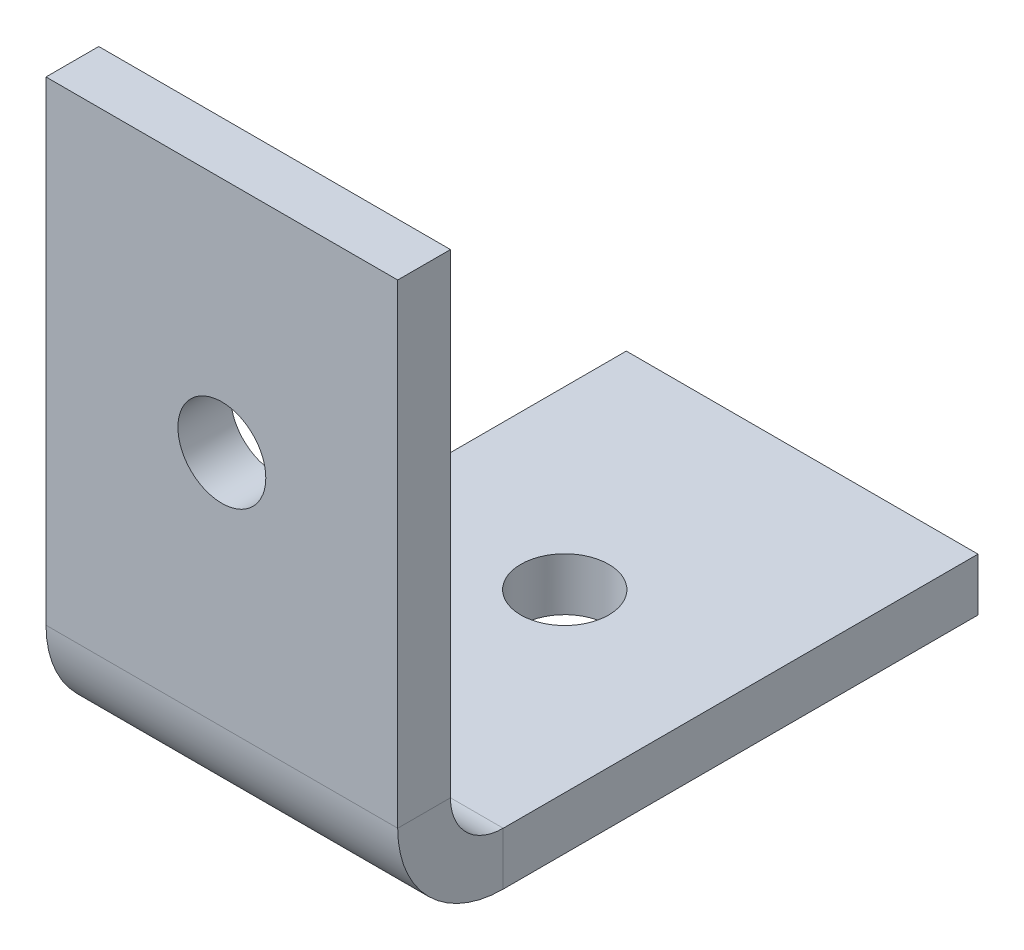
ISO-10303-21;
HEADER;
FILE_DESCRIPTION(('STEP AP214'),'2;1');
FILE_NAME('part.step','',(''),(''),'','','');
FILE_SCHEMA(('AUTOMOTIVE_DESIGN { 1 0 10303 214 1 1 1 1 }'));
ENDSEC;
DATA;
#1=APPLICATION_CONTEXT('core data for automotive mechanical design processes');
#2=APPLICATION_PROTOCOL_DEFINITION('international standard','automotive_design',2000,#1);
#3=PRODUCT_CONTEXT('',#1,'mechanical');
#4=PRODUCT('Part','Part','',(#3));
#5=PRODUCT_RELATED_PRODUCT_CATEGORY('part','',(#4));
#6=PRODUCT_DEFINITION_FORMATION('','',#4);
#7=PRODUCT_DEFINITION_CONTEXT('part definition',#1,'design');
#8=PRODUCT_DEFINITION('design','',#6,#7);
#9=PRODUCT_DEFINITION_SHAPE('','',#8);
#10=(LENGTH_UNIT() NAMED_UNIT(*) SI_UNIT(.MILLI.,.METRE.));
#11=(NAMED_UNIT(*) PLANE_ANGLE_UNIT() SI_UNIT($,.RADIAN.));
#12=(NAMED_UNIT(*) SI_UNIT($,.STERADIAN.) SOLID_ANGLE_UNIT());
#13=UNCERTAINTY_MEASURE_WITH_UNIT(LENGTH_MEASURE(1.E-05),#10,'distance_accuracy_value','');
#14=(GEOMETRIC_REPRESENTATION_CONTEXT(3) GLOBAL_UNCERTAINTY_ASSIGNED_CONTEXT((#13)) GLOBAL_UNIT_ASSIGNED_CONTEXT((#10,
#11,#12)) REPRESENTATION_CONTEXT('',''));
#15=CARTESIAN_POINT('',(0.,0.,0.));
#16=DIRECTION('',(0.,0.,1.));
#17=DIRECTION('',(1.,0.,0.));
#18=AXIS2_PLACEMENT_3D('',#15,#16,#17);
#19=CARTESIAN_POINT('',(20.,0.,-3.));
#20=DIRECTION('',(1.,0.,0.));
#21=DIRECTION('',(0.,0.,-1.));
#22=AXIS2_PLACEMENT_3D('',#19,#20,#21);
#23=PLANE('',#22);
#24=DIRECTION('',(0.,-1.,0.));
#25=VECTOR('',#24,1.);
#26=CARTESIAN_POINT('',(20.,0.,-3.));
#27=LINE('',#26,#25);
#28=CARTESIAN_POINT('',(20.,0.,-3.));
#29=VERTEX_POINT('',#28);
#30=CARTESIAN_POINT('',(20.,-3.,-3.));
#31=VERTEX_POINT('',#30);
#32=EDGE_CURVE('E11',#29,#31,#27,.T.);
#33=ORIENTED_EDGE('',*,*,#32,.F.);
#34=CARTESIAN_POINT('',(20.,3.,-3.));
#35=DIRECTION('',(-1.,0.,0.));
#36=DIRECTION('',(0.,0.,1.));
#37=AXIS2_PLACEMENT_3D('',#34,#35,#36);
#38=CIRCLE('',#37,3.);
#39=CARTESIAN_POINT('',(20.,3.,0.));
#40=VERTEX_POINT('',#39);
#41=EDGE_CURVE('E134',#40,#29,#38,.F.);
#42=ORIENTED_EDGE('',*,*,#41,.F.);
#43=DIRECTION('',(0.,0.,-1.));
#44=VECTOR('',#43,1.);
#45=CARTESIAN_POINT('',(20.,3.,3.));
#46=LINE('',#45,#44);
#47=CARTESIAN_POINT('',(20.,3.,3.));
#48=VERTEX_POINT('',#47);
#49=EDGE_CURVE('E45',#48,#40,#46,.T.);
#50=ORIENTED_EDGE('',*,*,#49,.F.);
#51=CARTESIAN_POINT('',(20.,3.,-3.));
#52=DIRECTION('',(1.,0.,0.));
#53=DIRECTION('',(0.,0.,-1.));
#54=AXIS2_PLACEMENT_3D('',#51,#52,#53);
#55=CIRCLE('',#54,6.);
#56=EDGE_CURVE('E127',#48,#31,#55,.T.);
#57=ORIENTED_EDGE('',*,*,#56,.T.);
#58=EDGE_LOOP('',(#33,#42,#50,#57));
#59=FACE_BOUND('',#58,.T.);
#60=ADVANCED_FACE('F37',(#59),#23,.T.);
#61=CARTESIAN_POINT('',(20.,3.,3.));
#62=DIRECTION('',(1.,0.,0.));
#63=DIRECTION('',(0.,0.,-1.));
#64=AXIS2_PLACEMENT_3D('',#61,#62,#63);
#65=PLANE('',#64);
#66=DIRECTION('',(0.,0.,-1.));
#67=VECTOR('',#66,1.);
#68=CARTESIAN_POINT('',(20.,0.,0.));
#69=LINE('',#68,#67);
#70=CARTESIAN_POINT('',(20.,0.,-30.));
#71=VERTEX_POINT('',#70);
#72=EDGE_CURVE('E184',#29,#71,#69,.T.);
#73=ORIENTED_EDGE('',*,*,#72,.F.);
#74=ORIENTED_EDGE('',*,*,#32,.T.);
#75=DIRECTION('',(0.,0.,-1.));
#76=VECTOR('',#75,1.);
#77=CARTESIAN_POINT('',(20.,-3.,0.));
#78=LINE('',#77,#76);
#79=CARTESIAN_POINT('',(20.,-3.,-30.));
#80=VERTEX_POINT('',#79);
#81=EDGE_CURVE('E93',#31,#80,#78,.T.);
#82=ORIENTED_EDGE('',*,*,#81,.T.);
#83=DIRECTION('',(0.,-1.,0.));
#84=VECTOR('',#83,1.);
#85=CARTESIAN_POINT('',(20.,0.,-30.));
#86=LINE('',#85,#84);
#87=EDGE_CURVE('E380',#71,#80,#86,.T.);
#88=ORIENTED_EDGE('',*,*,#87,.F.);
#89=EDGE_LOOP('',(#73,#74,#82,#88));
#90=FACE_BOUND('',#89,.T.);
#91=ADVANCED_FACE('F192',(#90),#65,.T.);
#92=CARTESIAN_POINT('',(0.,3.,0.));
#93=DIRECTION('',(-1.,0.,0.));
#94=DIRECTION('',(0.,0.,1.));
#95=AXIS2_PLACEMENT_3D('',#92,#93,#94);
#96=PLANE('',#95);
#97=DIRECTION('',(0.,0.,1.));
#98=VECTOR('',#97,1.);
#99=CARTESIAN_POINT('',(0.,3.,0.));
#100=LINE('',#99,#98);
#101=CARTESIAN_POINT('',(0.,3.,0.));
#102=VERTEX_POINT('',#101);
#103=CARTESIAN_POINT('',(0.,3.,3.));
#104=VERTEX_POINT('',#103);
#105=EDGE_CURVE('E80',#102,#104,#100,.T.);
#106=ORIENTED_EDGE('',*,*,#105,.F.);
#107=CARTESIAN_POINT('',(0.,3.,-3.));
#108=DIRECTION('',(-1.,0.,0.));
#109=DIRECTION('',(0.,0.,1.));
#110=AXIS2_PLACEMENT_3D('',#107,#108,#109);
#111=CIRCLE('',#110,3.);
#112=CARTESIAN_POINT('',(0.,0.,-3.));
#113=VERTEX_POINT('',#112);
#114=EDGE_CURVE('E150',#102,#113,#111,.F.);
#115=ORIENTED_EDGE('',*,*,#114,.T.);
#116=DIRECTION('',(0.,1.,0.));
#117=VECTOR('',#116,1.);
#118=CARTESIAN_POINT('',(0.,-3.,-3.));
#119=LINE('',#118,#117);
#120=CARTESIAN_POINT('',(0.,-3.,-3.));
#121=VERTEX_POINT('',#120);
#122=EDGE_CURVE('E87',#121,#113,#119,.T.);
#123=ORIENTED_EDGE('',*,*,#122,.F.);
#124=CARTESIAN_POINT('',(0.,3.,-3.));
#125=DIRECTION('',(1.,0.,0.));
#126=DIRECTION('',(0.,0.,-1.));
#127=AXIS2_PLACEMENT_3D('',#124,#125,#126);
#128=CIRCLE('',#127,6.);
#129=EDGE_CURVE('E157',#104,#121,#128,.T.);
#130=ORIENTED_EDGE('',*,*,#129,.F.);
#131=EDGE_LOOP('',(#106,#115,#123,#130));
#132=FACE_BOUND('',#131,.T.);
#133=ADVANCED_FACE('F190',(#132),#96,.T.);
#134=CARTESIAN_POINT('',(0.,-3.,-3.));
#135=DIRECTION('',(-1.,0.,0.));
#136=DIRECTION('',(0.,0.,1.));
#137=AXIS2_PLACEMENT_3D('',#134,#135,#136);
#138=PLANE('',#137);
#139=DIRECTION('',(0.,-1.,0.));
#140=VECTOR('',#139,1.);
#141=CARTESIAN_POINT('',(0.,0.,0.));
#142=LINE('',#141,#140);
#143=CARTESIAN_POINT('',(0.,30.,0.));
#144=VERTEX_POINT('',#143);
#145=EDGE_CURVE('E152',#144,#102,#142,.T.);
#146=ORIENTED_EDGE('',*,*,#145,.T.);
#147=ORIENTED_EDGE('',*,*,#105,.T.);
#148=DIRECTION('',(0.,1.,0.));
#149=VECTOR('',#148,1.);
#150=CARTESIAN_POINT('',(0.,0.,3.));
#151=LINE('',#150,#149);
#152=CARTESIAN_POINT('',(0.,30.,3.));
#153=VERTEX_POINT('',#152);
#154=EDGE_CURVE('E155',#153,#104,#151,.F.);
#155=ORIENTED_EDGE('',*,*,#154,.F.);
#156=DIRECTION('',(0.,0.,-1.));
#157=VECTOR('',#156,1.);
#158=CARTESIAN_POINT('',(0.,30.,3.));
#159=LINE('',#158,#157);
#160=EDGE_CURVE('E115',#153,#144,#159,.T.);
#161=ORIENTED_EDGE('',*,*,#160,.T.);
#162=EDGE_LOOP('',(#146,#147,#155,#161));
#163=FACE_BOUND('',#162,.T.);
#164=ADVANCED_FACE('F186',(#163),#138,.T.);
#165=CARTESIAN_POINT('',(20.,-3.,0.));
#166=DIRECTION('',(0.,1.,0.));
#167=DIRECTION('',(0.,0.,1.));
#168=AXIS2_PLACEMENT_3D('',#165,#166,#167);
#169=PLANE('',#168);
#170=CARTESIAN_POINT('',(10.,-3.,-16.5));
#171=DIRECTION('',(0.,-1.,0.));
#172=DIRECTION('',(0.,0.,-1.));
#173=AXIS2_PLACEMENT_3D('',#170,#171,#172);
#174=CIRCLE('',#173,2.5);
#175=CARTESIAN_POINT('',(10.,-3.,-19.));
#176=VERTEX_POINT('',#175);
#177=EDGE_CURVE('E144',#176,#176,#174,.T.);
#178=ORIENTED_EDGE('',*,*,#177,.F.);
#179=EDGE_LOOP('',(#178));
#180=FACE_BOUND('',#179,.T.);
#181=DIRECTION('',(0.,0.,-1.));
#182=VECTOR('',#181,1.);
#183=CARTESIAN_POINT('',(0.,-3.,0.));
#184=LINE('',#183,#182);
#185=CARTESIAN_POINT('',(0.,-3.,-30.));
#186=VERTEX_POINT('',#185);
#187=EDGE_CURVE('E140',#121,#186,#184,.T.);
#188=ORIENTED_EDGE('',*,*,#187,.T.);
#189=DIRECTION('',(-1.,0.,0.));
#190=VECTOR('',#189,1.);
#191=CARTESIAN_POINT('',(20.,-3.,-30.));
#192=LINE('',#191,#190);
#193=EDGE_CURVE('E171',#80,#186,#192,.T.);
#194=ORIENTED_EDGE('',*,*,#193,.F.);
#195=ORIENTED_EDGE('',*,*,#81,.F.);
#196=DIRECTION('',(-1.,0.,0.));
#197=VECTOR('',#196,1.);
#198=CARTESIAN_POINT('',(20.,-3.,-3.));
#199=LINE('',#198,#197);
#200=EDGE_CURVE('E139',#31,#121,#199,.T.);
#201=ORIENTED_EDGE('',*,*,#200,.T.);
#202=EDGE_LOOP('',(#188,#194,#195,#201));
#203=FACE_BOUND('',#202,.T.);
#204=ADVANCED_FACE('F198',(#180,#203),#169,.F.);
#205=CARTESIAN_POINT('',(20.,0.,-30.));
#206=DIRECTION('',(0.,0.,-1.));
#207=DIRECTION('',(-1.,0.,0.));
#208=AXIS2_PLACEMENT_3D('',#205,#206,#207);
#209=PLANE('',#208);
#210=DIRECTION('',(0.,-1.,0.));
#211=VECTOR('',#210,1.);
#212=CARTESIAN_POINT('',(0.,0.,-30.));
#213=LINE('',#212,#211);
#214=CARTESIAN_POINT('',(0.,0.,-30.));
#215=VERTEX_POINT('',#214);
#216=EDGE_CURVE('E143',#215,#186,#213,.T.);
#217=ORIENTED_EDGE('',*,*,#216,.F.);
#218=DIRECTION('',(-1.,0.,0.));
#219=VECTOR('',#218,1.);
#220=CARTESIAN_POINT('',(20.,0.,-30.));
#221=LINE('',#220,#219);
#222=EDGE_CURVE('E169',#71,#215,#221,.T.);
#223=ORIENTED_EDGE('',*,*,#222,.F.);
#224=ORIENTED_EDGE('',*,*,#87,.T.);
#225=ORIENTED_EDGE('',*,*,#193,.T.);
#226=EDGE_LOOP('',(#217,#223,#224,#225));
#227=FACE_BOUND('',#226,.T.);
#228=ADVANCED_FACE('F227',(#227),#209,.T.);
#229=CARTESIAN_POINT('',(20.,0.,0.));
#230=DIRECTION('',(0.,1.,0.));
#231=DIRECTION('',(0.,0.,1.));
#232=AXIS2_PLACEMENT_3D('',#229,#230,#231);
#233=PLANE('',#232);
#234=CARTESIAN_POINT('',(10.,0.,-16.5));
#235=DIRECTION('',(0.,1.,0.));
#236=DIRECTION('',(0.,0.,1.));
#237=AXIS2_PLACEMENT_3D('',#234,#235,#236);
#238=CIRCLE('',#237,2.5);
#239=CARTESIAN_POINT('',(10.,0.,-14.));
#240=VERTEX_POINT('',#239);
#241=EDGE_CURVE('E371',#240,#240,#238,.F.);
#242=ORIENTED_EDGE('',*,*,#241,.T.);
#243=EDGE_LOOP('',(#242));
#244=FACE_BOUND('',#243,.T.);
#245=DIRECTION('',(0.,0.,-1.));
#246=VECTOR('',#245,1.);
#247=CARTESIAN_POINT('',(0.,0.,0.));
#248=LINE('',#247,#246);
#249=EDGE_CURVE('E147',#113,#215,#248,.T.);
#250=ORIENTED_EDGE('',*,*,#249,.F.);
#251=DIRECTION('',(-1.,0.,0.));
#252=VECTOR('',#251,1.);
#253=CARTESIAN_POINT('',(20.,0.,-3.));
#254=LINE('',#253,#252);
#255=EDGE_CURVE('E166',#29,#113,#254,.T.);
#256=ORIENTED_EDGE('',*,*,#255,.F.);
#257=ORIENTED_EDGE('',*,*,#72,.T.);
#258=ORIENTED_EDGE('',*,*,#222,.T.);
#259=EDGE_LOOP('',(#250,#256,#257,#258));
#260=FACE_BOUND('',#259,.T.);
#261=ADVANCED_FACE('F232',(#244,#260),#233,.T.);
#262=CARTESIAN_POINT('',(20.,3.,-3.));
#263=DIRECTION('',(-1.,0.,0.));
#264=DIRECTION('',(0.,0.,1.));
#265=AXIS2_PLACEMENT_3D('',#262,#263,#264);
#266=CYLINDRICAL_SURFACE('',#265,3.);
#267=ORIENTED_EDGE('',*,*,#114,.F.);
#268=DIRECTION('',(-1.,0.,0.));
#269=VECTOR('',#268,1.);
#270=CARTESIAN_POINT('',(20.,3.,0.));
#271=LINE('',#270,#269);
#272=EDGE_CURVE('E163',#40,#102,#271,.T.);
#273=ORIENTED_EDGE('',*,*,#272,.F.);
#274=ORIENTED_EDGE('',*,*,#41,.T.);
#275=ORIENTED_EDGE('',*,*,#255,.T.);
#276=EDGE_LOOP('',(#267,#273,#274,#275));
#277=FACE_BOUND('',#276,.T.);
#278=ADVANCED_FACE('F180',(#277),#266,.F.);
#279=CARTESIAN_POINT('',(20.,0.,0.));
#280=DIRECTION('',(0.,0.,-1.));
#281=DIRECTION('',(-1.,0.,0.));
#282=AXIS2_PLACEMENT_3D('',#279,#280,#281);
#283=PLANE('',#282);
#284=CARTESIAN_POINT('',(10.,16.5,0.));
#285=DIRECTION('',(0.,0.,-1.));
#286=DIRECTION('',(-1.,0.,0.));
#287=AXIS2_PLACEMENT_3D('',#284,#285,#286);
#288=CIRCLE('',#287,2.5);
#289=CARTESIAN_POINT('',(7.5,16.5,0.));
#290=VERTEX_POINT('',#289);
#291=EDGE_CURVE('E367',#290,#290,#288,.F.);
#292=ORIENTED_EDGE('',*,*,#291,.T.);
#293=EDGE_LOOP('',(#292));
#294=FACE_BOUND('',#293,.T.);
#295=ORIENTED_EDGE('',*,*,#145,.F.);
#296=DIRECTION('',(-1.,0.,0.));
#297=VECTOR('',#296,1.);
#298=CARTESIAN_POINT('',(20.,30.,0.));
#299=LINE('',#298,#297);
#300=CARTESIAN_POINT('',(20.,30.,0.));
#301=VERTEX_POINT('',#300);
#302=EDGE_CURVE('E117',#301,#144,#299,.T.);
#303=ORIENTED_EDGE('',*,*,#302,.F.);
#304=DIRECTION('',(0.,-1.,0.));
#305=VECTOR('',#304,1.);
#306=CARTESIAN_POINT('',(20.,0.,0.));
#307=LINE('',#306,#305);
#308=EDGE_CURVE('E132',#301,#40,#307,.T.);
#309=ORIENTED_EDGE('',*,*,#308,.T.);
#310=ORIENTED_EDGE('',*,*,#272,.T.);
#311=EDGE_LOOP('',(#295,#303,#309,#310));
#312=FACE_BOUND('',#311,.T.);
#313=ADVANCED_FACE('F185',(#294,#312),#283,.T.);
#314=CARTESIAN_POINT('',(20.,30.,3.));
#315=DIRECTION('',(0.,1.,0.));
#316=DIRECTION('',(0.,0.,1.));
#317=AXIS2_PLACEMENT_3D('',#314,#315,#316);
#318=PLANE('',#317);
#319=ORIENTED_EDGE('',*,*,#160,.F.);
#320=DIRECTION('',(-1.,0.,0.));
#321=VECTOR('',#320,1.);
#322=CARTESIAN_POINT('',(20.,30.,3.));
#323=LINE('',#322,#321);
#324=CARTESIAN_POINT('',(20.,30.,3.));
#325=VERTEX_POINT('',#324);
#326=EDGE_CURVE('E109',#325,#153,#323,.T.);
#327=ORIENTED_EDGE('',*,*,#326,.F.);
#328=DIRECTION('',(0.,0.,-1.));
#329=VECTOR('',#328,1.);
#330=CARTESIAN_POINT('',(20.,30.,3.));
#331=LINE('',#330,#329);
#332=EDGE_CURVE('E113',#325,#301,#331,.T.);
#333=ORIENTED_EDGE('',*,*,#332,.T.);
#334=ORIENTED_EDGE('',*,*,#302,.T.);
#335=EDGE_LOOP('',(#319,#327,#333,#334));
#336=FACE_BOUND('',#335,.T.);
#337=ADVANCED_FACE('F111',(#336),#318,.T.);
#338=CARTESIAN_POINT('',(20.,0.,3.));
#339=DIRECTION('',(0.,0.,-1.));
#340=DIRECTION('',(-1.,0.,0.));
#341=AXIS2_PLACEMENT_3D('',#338,#339,#340);
#342=PLANE('',#341);
#343=CARTESIAN_POINT('',(10.,16.5,3.));
#344=DIRECTION('',(0.,0.,1.));
#345=DIRECTION('',(1.,0.,0.));
#346=AXIS2_PLACEMENT_3D('',#343,#344,#345);
#347=CIRCLE('',#346,2.5);
#348=CARTESIAN_POINT('',(12.5,16.5,3.));
#349=VERTEX_POINT('',#348);
#350=EDGE_CURVE('E370',#349,#349,#347,.T.);
#351=ORIENTED_EDGE('',*,*,#350,.F.);
#352=EDGE_LOOP('',(#351));
#353=FACE_BOUND('',#352,.T.);
#354=ORIENTED_EDGE('',*,*,#154,.T.);
#355=DIRECTION('',(-1.,0.,0.));
#356=VECTOR('',#355,1.);
#357=CARTESIAN_POINT('',(20.,3.,3.));
#358=LINE('',#357,#356);
#359=EDGE_CURVE('E118',#48,#104,#358,.T.);
#360=ORIENTED_EDGE('',*,*,#359,.F.);
#361=DIRECTION('',(0.,1.,0.));
#362=VECTOR('',#361,1.);
#363=CARTESIAN_POINT('',(20.,0.,3.));
#364=LINE('',#363,#362);
#365=EDGE_CURVE('E122',#325,#48,#364,.F.);
#366=ORIENTED_EDGE('',*,*,#365,.F.);
#367=ORIENTED_EDGE('',*,*,#326,.T.);
#368=EDGE_LOOP('',(#354,#360,#366,#367));
#369=FACE_BOUND('',#368,.T.);
#370=ADVANCED_FACE('F123',(#353,#369),#342,.F.);
#371=CARTESIAN_POINT('',(20.,3.,-3.));
#372=DIRECTION('',(-1.,0.,0.));
#373=DIRECTION('',(0.,0.,1.));
#374=AXIS2_PLACEMENT_3D('',#371,#372,#373);
#375=CYLINDRICAL_SURFACE('',#374,6.);
#376=ORIENTED_EDGE('',*,*,#129,.T.);
#377=ORIENTED_EDGE('',*,*,#200,.F.);
#378=ORIENTED_EDGE('',*,*,#56,.F.);
#379=ORIENTED_EDGE('',*,*,#359,.T.);
#380=EDGE_LOOP('',(#376,#377,#378,#379));
#381=FACE_BOUND('',#380,.T.);
#382=ADVANCED_FACE('F188',(#381),#375,.T.);
#383=CARTESIAN_POINT('',(20.,3.,-3.));
#384=DIRECTION('',(-1.,0.,0.));
#385=DIRECTION('',(0.,0.,1.));
#386=AXIS2_PLACEMENT_3D('',#383,#384,#385);
#387=PLANE('',#386);
#388=ORIENTED_EDGE('',*,*,#365,.T.);
#389=ORIENTED_EDGE('',*,*,#49,.T.);
#390=ORIENTED_EDGE('',*,*,#308,.F.);
#391=ORIENTED_EDGE('',*,*,#332,.F.);
#392=EDGE_LOOP('',(#388,#389,#390,#391));
#393=FACE_BOUND('',#392,.T.);
#394=ADVANCED_FACE('F130',(#393),#387,.F.);
#395=CARTESIAN_POINT('',(0.,3.,-3.));
#396=DIRECTION('',(-1.,0.,0.));
#397=DIRECTION('',(0.,0.,1.));
#398=AXIS2_PLACEMENT_3D('',#395,#396,#397);
#399=PLANE('',#398);
#400=ORIENTED_EDGE('',*,*,#187,.F.);
#401=ORIENTED_EDGE('',*,*,#122,.T.);
#402=ORIENTED_EDGE('',*,*,#249,.T.);
#403=ORIENTED_EDGE('',*,*,#216,.T.);
#404=EDGE_LOOP('',(#400,#401,#402,#403));
#405=FACE_BOUND('',#404,.T.);
#406=ADVANCED_FACE('F276',(#405),#399,.T.);
#407=CARTESIAN_POINT('',(10.,30.001,-16.5));
#408=DIRECTION('',(0.,-1.,0.));
#409=DIRECTION('',(0.,0.,-1.));
#410=AXIS2_PLACEMENT_3D('',#407,#408,#409);
#411=CYLINDRICAL_SURFACE('',#410,2.5);
#412=ORIENTED_EDGE('',*,*,#241,.F.);
#413=EDGE_LOOP('',(#412));
#414=FACE_BOUND('',#413,.T.);
#415=ORIENTED_EDGE('',*,*,#177,.T.);
#416=EDGE_LOOP('',(#415));
#417=FACE_BOUND('',#416,.T.);
#418=ADVANCED_FACE('F286',(#414,#417),#411,.F.);
#419=CARTESIAN_POINT('',(10.,16.5,-30.001));
#420=DIRECTION('',(0.,0.,1.));
#421=DIRECTION('',(1.,0.,0.));
#422=AXIS2_PLACEMENT_3D('',#419,#420,#421);
#423=CYLINDRICAL_SURFACE('',#422,2.5);
#424=ORIENTED_EDGE('',*,*,#291,.F.);
#425=EDGE_LOOP('',(#424));
#426=FACE_BOUND('',#425,.T.);
#427=ORIENTED_EDGE('',*,*,#350,.T.);
#428=EDGE_LOOP('',(#427));
#429=FACE_BOUND('',#428,.T.);
#430=ADVANCED_FACE('F313',(#426,#429),#423,.F.);
#431=CLOSED_SHELL('',(#60,#91,#133,#164,#204,#228,#261,#278,#313,#337,#370,#382,#394,#406,#418,#430));
#432=MANIFOLD_SOLID_BREP('B2',#431);
#433=ADVANCED_BREP_SHAPE_REPRESENTATION('',(#18,#432),#14);
#434=SHAPE_DEFINITION_REPRESENTATION(#9,#433);
ENDSEC;
END-ISO-10303-21;
